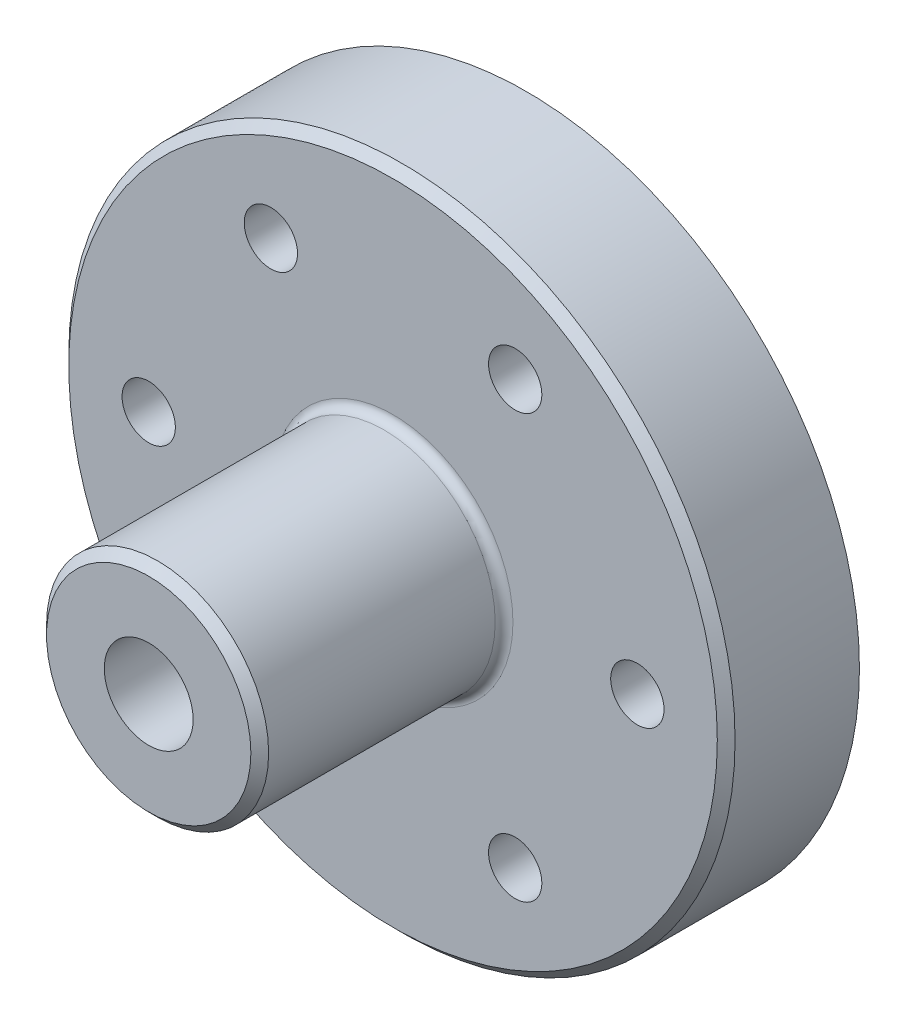
ISO-10303-21;
HEADER;
FILE_DESCRIPTION(('STEP AP214'),'2;1');
FILE_NAME('part.step','',(''),(''),'','','');
FILE_SCHEMA(('AUTOMOTIVE_DESIGN { 1 0 10303 214 1 1 1 1 }'));
ENDSEC;
DATA;
#1=APPLICATION_CONTEXT('core data for automotive mechanical design processes');
#2=APPLICATION_PROTOCOL_DEFINITION('international standard','automotive_design',2000,#1);
#3=PRODUCT_CONTEXT('',#1,'mechanical');
#4=PRODUCT('Part','Part','',(#3));
#5=PRODUCT_RELATED_PRODUCT_CATEGORY('part','',(#4));
#6=PRODUCT_DEFINITION_FORMATION('','',#4);
#7=PRODUCT_DEFINITION_CONTEXT('part definition',#1,'design');
#8=PRODUCT_DEFINITION('design','',#6,#7);
#9=PRODUCT_DEFINITION_SHAPE('','',#8);
#10=(LENGTH_UNIT() NAMED_UNIT(*) SI_UNIT(.MILLI.,.METRE.));
#11=(NAMED_UNIT(*) PLANE_ANGLE_UNIT() SI_UNIT($,.RADIAN.));
#12=(NAMED_UNIT(*) SI_UNIT($,.STERADIAN.) SOLID_ANGLE_UNIT());
#13=UNCERTAINTY_MEASURE_WITH_UNIT(LENGTH_MEASURE(1.E-05),#10,'distance_accuracy_value','');
#14=(GEOMETRIC_REPRESENTATION_CONTEXT(3) GLOBAL_UNCERTAINTY_ASSIGNED_CONTEXT((#13)) GLOBAL_UNIT_ASSIGNED_CONTEXT((#10,
#11,#12)) REPRESENTATION_CONTEXT('',''));
#15=CARTESIAN_POINT('',(0.,0.,0.));
#16=DIRECTION('',(0.,0.,1.));
#17=DIRECTION('',(1.,0.,0.));
#18=AXIS2_PLACEMENT_3D('',#15,#16,#17);
#19=CARTESIAN_POINT('',(0.,0.,30.));
#20=DIRECTION('',(0.,0.,1.));
#21=DIRECTION('',(1.,0.,0.));
#22=AXIS2_PLACEMENT_3D('',#19,#20,#21);
#23=PLANE('',#22);
#24=CARTESIAN_POINT('',(0.,0.,30.));
#25=DIRECTION('',(0.,0.,1.));
#26=DIRECTION('',(1.,0.,0.));
#27=AXIS2_PLACEMENT_3D('',#24,#25,#26);
#28=CIRCLE('',#27,27.);
#29=CARTESIAN_POINT('',(27.,0.,30.));
#30=VERTEX_POINT('',#29);
#31=EDGE_CURVE('E10',#30,#30,#28,.F.);
#32=ORIENTED_EDGE('',*,*,#31,.T.);
#33=EDGE_LOOP('',(#32));
#34=FACE_BOUND('',#33,.T.);
#35=CARTESIAN_POINT('',(0.,0.,30.));
#36=DIRECTION('',(0.,0.,1.));
#37=DIRECTION('',(1.,0.,0.));
#38=AXIS2_PLACEMENT_3D('',#35,#36,#37);
#39=CIRCLE('',#38,73.);
#40=CARTESIAN_POINT('',(73.,0.,30.));
#41=VERTEX_POINT('',#40);
#42=EDGE_CURVE('E71',#41,#41,#39,.T.);
#43=ORIENTED_EDGE('',*,*,#42,.T.);
#44=EDGE_LOOP('',(#43));
#45=FACE_BOUND('',#44,.T.);
#46=CARTESIAN_POINT('',(27.4999999999996,-47.6313972081444,30.));
#47=DIRECTION('',(0.,0.,1.));
#48=DIRECTION('',(1.,0.,0.));
#49=AXIS2_PLACEMENT_3D('',#46,#47,#48);
#50=CIRCLE('',#49,5.99999999999999);
#51=CARTESIAN_POINT('',(33.4999999999995,-47.6313972081444,30.));
#52=VERTEX_POINT('',#51);
#53=EDGE_CURVE('E112',#52,#52,#50,.T.);
#54=ORIENTED_EDGE('',*,*,#53,.F.);
#55=EDGE_LOOP('',(#54));
#56=FACE_BOUND('',#55,.T.);
#57=CARTESIAN_POINT('',(27.5000000000002,47.631397208144,30.));
#58=DIRECTION('',(0.,0.,1.));
#59=DIRECTION('',(1.,0.,0.));
#60=AXIS2_PLACEMENT_3D('',#57,#58,#59);
#61=CIRCLE('',#60,6.);
#62=CARTESIAN_POINT('',(33.5000000000002,47.631397208144,30.));
#63=VERTEX_POINT('',#62);
#64=EDGE_CURVE('E96',#63,#63,#61,.T.);
#65=ORIENTED_EDGE('',*,*,#64,.F.);
#66=EDGE_LOOP('',(#65));
#67=FACE_BOUND('',#66,.T.);
#68=CARTESIAN_POINT('',(-55.,0.,30.));
#69=DIRECTION('',(0.,0.,1.));
#70=DIRECTION('',(1.,0.,0.));
#71=AXIS2_PLACEMENT_3D('',#68,#69,#70);
#72=CIRCLE('',#71,5.99999999999999);
#73=CARTESIAN_POINT('',(-49.,0.,30.));
#74=VERTEX_POINT('',#73);
#75=EDGE_CURVE('E83',#74,#74,#72,.T.);
#76=ORIENTED_EDGE('',*,*,#75,.F.);
#77=EDGE_LOOP('',(#76));
#78=FACE_BOUND('',#77,.T.);
#79=CARTESIAN_POINT('',(-27.4999999999999,47.6313972081442,30.));
#80=DIRECTION('',(0.,0.,1.));
#81=DIRECTION('',(1.,0.,0.));
#82=AXIS2_PLACEMENT_3D('',#79,#80,#81);
#83=CIRCLE('',#82,5.99999999999999);
#84=CARTESIAN_POINT('',(-21.4999999999999,47.6313972081442,30.));
#85=VERTEX_POINT('',#84);
#86=EDGE_CURVE('E88',#85,#85,#83,.T.);
#87=ORIENTED_EDGE('',*,*,#86,.F.);
#88=EDGE_LOOP('',(#87));
#89=FACE_BOUND('',#88,.T.);
#90=CARTESIAN_POINT('',(55.,-3.84062947272745E-13,30.));
#91=DIRECTION('',(0.,0.,1.));
#92=DIRECTION('',(1.,0.,0.));
#93=AXIS2_PLACEMENT_3D('',#90,#91,#92);
#94=CIRCLE('',#93,6.);
#95=CARTESIAN_POINT('',(61.,-3.84062947272745E-13,30.));
#96=VERTEX_POINT('',#95);
#97=EDGE_CURVE('E104',#96,#96,#94,.T.);
#98=ORIENTED_EDGE('',*,*,#97,.F.);
#99=EDGE_LOOP('',(#98));
#100=FACE_BOUND('',#99,.T.);
#101=CARTESIAN_POINT('',(-27.5000000000006,-47.6313972081438,30.));
#102=DIRECTION('',(0.,0.,1.));
#103=DIRECTION('',(1.,0.,0.));
#104=AXIS2_PLACEMENT_3D('',#101,#102,#103);
#105=CIRCLE('',#104,5.99999999999999);
#106=CARTESIAN_POINT('',(-21.5000000000006,-47.6313972081438,30.));
#107=VERTEX_POINT('',#106);
#108=EDGE_CURVE('E120',#107,#107,#105,.T.);
#109=ORIENTED_EDGE('',*,*,#108,.F.);
#110=EDGE_LOOP('',(#109));
#111=FACE_BOUND('',#110,.T.);
#112=ADVANCED_FACE('F43',(#34,#45,#56,#67,#78,#89,#100,#111),#23,.T.);
#113=CARTESIAN_POINT('',(0.,0.,0.));
#114=DIRECTION('',(0.,0.,1.));
#115=DIRECTION('',(1.,0.,0.));
#116=AXIS2_PLACEMENT_3D('',#113,#114,#115);
#117=PLANE('',#116);
#118=CARTESIAN_POINT('',(0.,0.,0.));
#119=DIRECTION('',(0.,0.,1.));
#120=DIRECTION('',(1.,0.,0.));
#121=AXIS2_PLACEMENT_3D('',#118,#119,#120);
#122=CIRCLE('',#121,75.);
#123=CARTESIAN_POINT('',(75.,0.,0.));
#124=VERTEX_POINT('',#123);
#125=EDGE_CURVE('E79',#124,#124,#122,.T.);
#126=ORIENTED_EDGE('',*,*,#125,.F.);
#127=EDGE_LOOP('',(#126));
#128=FACE_BOUND('',#127,.T.);
#129=CARTESIAN_POINT('',(-55.,0.,0.));
#130=DIRECTION('',(0.,0.,1.));
#131=DIRECTION('',(1.,0.,0.));
#132=AXIS2_PLACEMENT_3D('',#129,#130,#131);
#133=CIRCLE('',#132,5.99999999999999);
#134=CARTESIAN_POINT('',(-49.,0.,0.));
#135=VERTEX_POINT('',#134);
#136=EDGE_CURVE('E84',#135,#135,#133,.T.);
#137=ORIENTED_EDGE('',*,*,#136,.T.);
#138=EDGE_LOOP('',(#137));
#139=FACE_BOUND('',#138,.T.);
#140=CARTESIAN_POINT('',(-27.4999999999999,47.6313972081442,0.));
#141=DIRECTION('',(0.,0.,1.));
#142=DIRECTION('',(1.,0.,0.));
#143=AXIS2_PLACEMENT_3D('',#140,#141,#142);
#144=CIRCLE('',#143,5.99999999999999);
#145=CARTESIAN_POINT('',(-21.4999999999999,47.6313972081442,0.));
#146=VERTEX_POINT('',#145);
#147=EDGE_CURVE('E92',#146,#146,#144,.T.);
#148=ORIENTED_EDGE('',*,*,#147,.T.);
#149=EDGE_LOOP('',(#148));
#150=FACE_BOUND('',#149,.T.);
#151=CARTESIAN_POINT('',(27.5000000000002,47.631397208144,0.));
#152=DIRECTION('',(0.,0.,1.));
#153=DIRECTION('',(1.,0.,0.));
#154=AXIS2_PLACEMENT_3D('',#151,#152,#153);
#155=CIRCLE('',#154,6.);
#156=CARTESIAN_POINT('',(33.5000000000002,47.631397208144,0.));
#157=VERTEX_POINT('',#156);
#158=EDGE_CURVE('E100',#157,#157,#155,.T.);
#159=ORIENTED_EDGE('',*,*,#158,.T.);
#160=EDGE_LOOP('',(#159));
#161=FACE_BOUND('',#160,.T.);
#162=CARTESIAN_POINT('',(55.,-3.84062947272745E-13,0.));
#163=DIRECTION('',(0.,0.,1.));
#164=DIRECTION('',(1.,0.,0.));
#165=AXIS2_PLACEMENT_3D('',#162,#163,#164);
#166=CIRCLE('',#165,6.);
#167=CARTESIAN_POINT('',(61.,-3.84062947272745E-13,0.));
#168=VERTEX_POINT('',#167);
#169=EDGE_CURVE('E108',#168,#168,#166,.T.);
#170=ORIENTED_EDGE('',*,*,#169,.T.);
#171=EDGE_LOOP('',(#170));
#172=FACE_BOUND('',#171,.T.);
#173=CARTESIAN_POINT('',(27.4999999999996,-47.6313972081444,0.));
#174=DIRECTION('',(0.,0.,1.));
#175=DIRECTION('',(1.,0.,0.));
#176=AXIS2_PLACEMENT_3D('',#173,#174,#175);
#177=CIRCLE('',#176,5.99999999999999);
#178=CARTESIAN_POINT('',(33.4999999999995,-47.6313972081444,0.));
#179=VERTEX_POINT('',#178);
#180=EDGE_CURVE('E116',#179,#179,#177,.T.);
#181=ORIENTED_EDGE('',*,*,#180,.T.);
#182=EDGE_LOOP('',(#181));
#183=FACE_BOUND('',#182,.T.);
#184=CARTESIAN_POINT('',(-27.5000000000006,-47.6313972081438,0.));
#185=DIRECTION('',(0.,0.,1.));
#186=DIRECTION('',(1.,0.,0.));
#187=AXIS2_PLACEMENT_3D('',#184,#185,#186);
#188=CIRCLE('',#187,5.99999999999999);
#189=CARTESIAN_POINT('',(-21.5000000000006,-47.6313972081438,0.));
#190=VERTEX_POINT('',#189);
#191=EDGE_CURVE('E124',#190,#190,#188,.T.);
#192=ORIENTED_EDGE('',*,*,#191,.T.);
#193=EDGE_LOOP('',(#192));
#194=FACE_BOUND('',#193,.T.);
#195=ADVANCED_FACE('F155',(#128,#139,#150,#161,#172,#183,#194),#117,.F.);
#196=CARTESIAN_POINT('',(0.,0.,30.));
#197=DIRECTION('',(0.,0.,-1.));
#198=DIRECTION('',(-1.,0.,0.));
#199=AXIS2_PLACEMENT_3D('',#196,#197,#198);
#200=CYLINDRICAL_SURFACE('',#199,75.);
#201=CARTESIAN_POINT('',(0.,0.,28.));
#202=DIRECTION('',(0.,0.,1.));
#203=DIRECTION('',(1.,0.,0.));
#204=AXIS2_PLACEMENT_3D('',#201,#202,#203);
#205=CIRCLE('',#204,75.);
#206=CARTESIAN_POINT('',(75.,0.,28.));
#207=VERTEX_POINT('',#206);
#208=EDGE_CURVE('E67',#207,#207,#205,.F.);
#209=ORIENTED_EDGE('',*,*,#208,.T.);
#210=EDGE_LOOP('',(#209));
#211=FACE_BOUND('',#210,.T.);
#212=ORIENTED_EDGE('',*,*,#125,.T.);
#213=EDGE_LOOP('',(#212));
#214=FACE_BOUND('',#213,.T.);
#215=ADVANCED_FACE('F161',(#211,#214),#200,.T.);
#216=CARTESIAN_POINT('',(-55.,0.,30.));
#217=DIRECTION('',(0.,0.,-1.));
#218=DIRECTION('',(-1.,0.,0.));
#219=AXIS2_PLACEMENT_3D('',#216,#217,#218);
#220=CYLINDRICAL_SURFACE('',#219,5.99999999999999);
#221=ORIENTED_EDGE('',*,*,#75,.T.);
#222=EDGE_LOOP('',(#221));
#223=FACE_BOUND('',#222,.T.);
#224=ORIENTED_EDGE('',*,*,#136,.F.);
#225=EDGE_LOOP('',(#224));
#226=FACE_BOUND('',#225,.T.);
#227=ADVANCED_FACE('F223',(#223,#226),#220,.F.);
#228=CARTESIAN_POINT('',(-27.4999999999999,47.6313972081442,30.));
#229=DIRECTION('',(0.,0.,-1.));
#230=DIRECTION('',(-1.,0.,0.));
#231=AXIS2_PLACEMENT_3D('',#228,#229,#230);
#232=CYLINDRICAL_SURFACE('',#231,5.99999999999999);
#233=ORIENTED_EDGE('',*,*,#86,.T.);
#234=EDGE_LOOP('',(#233));
#235=FACE_BOUND('',#234,.T.);
#236=ORIENTED_EDGE('',*,*,#147,.F.);
#237=EDGE_LOOP('',(#236));
#238=FACE_BOUND('',#237,.T.);
#239=ADVANCED_FACE('F280',(#235,#238),#232,.F.);
#240=CARTESIAN_POINT('',(27.5000000000002,47.631397208144,30.));
#241=DIRECTION('',(0.,0.,-1.));
#242=DIRECTION('',(-1.,0.,0.));
#243=AXIS2_PLACEMENT_3D('',#240,#241,#242);
#244=CYLINDRICAL_SURFACE('',#243,6.);
#245=ORIENTED_EDGE('',*,*,#64,.T.);
#246=EDGE_LOOP('',(#245));
#247=FACE_BOUND('',#246,.T.);
#248=ORIENTED_EDGE('',*,*,#158,.F.);
#249=EDGE_LOOP('',(#248));
#250=FACE_BOUND('',#249,.T.);
#251=ADVANCED_FACE('F270',(#247,#250),#244,.F.);
#252=CARTESIAN_POINT('',(55.,-3.84062947272745E-13,30.));
#253=DIRECTION('',(0.,0.,-1.));
#254=DIRECTION('',(-1.,0.,0.));
#255=AXIS2_PLACEMENT_3D('',#252,#253,#254);
#256=CYLINDRICAL_SURFACE('',#255,6.);
#257=ORIENTED_EDGE('',*,*,#97,.T.);
#258=EDGE_LOOP('',(#257));
#259=FACE_BOUND('',#258,.T.);
#260=ORIENTED_EDGE('',*,*,#169,.F.);
#261=EDGE_LOOP('',(#260));
#262=FACE_BOUND('',#261,.T.);
#263=ADVANCED_FACE('F260',(#259,#262),#256,.F.);
#264=CARTESIAN_POINT('',(27.4999999999996,-47.6313972081444,30.));
#265=DIRECTION('',(0.,0.,-1.));
#266=DIRECTION('',(-1.,0.,0.));
#267=AXIS2_PLACEMENT_3D('',#264,#265,#266);
#268=CYLINDRICAL_SURFACE('',#267,5.99999999999999);
#269=ORIENTED_EDGE('',*,*,#53,.T.);
#270=EDGE_LOOP('',(#269));
#271=FACE_BOUND('',#270,.T.);
#272=ORIENTED_EDGE('',*,*,#180,.F.);
#273=EDGE_LOOP('',(#272));
#274=FACE_BOUND('',#273,.T.);
#275=ADVANCED_FACE('F150',(#271,#274),#268,.F.);
#276=CARTESIAN_POINT('',(-27.5000000000006,-47.6313972081438,30.));
#277=DIRECTION('',(0.,0.,-1.));
#278=DIRECTION('',(-1.,0.,0.));
#279=AXIS2_PLACEMENT_3D('',#276,#277,#278);
#280=CYLINDRICAL_SURFACE('',#279,5.99999999999999);
#281=ORIENTED_EDGE('',*,*,#108,.T.);
#282=EDGE_LOOP('',(#281));
#283=FACE_BOUND('',#282,.T.);
#284=ORIENTED_EDGE('',*,*,#191,.F.);
#285=EDGE_LOOP('',(#284));
#286=FACE_BOUND('',#285,.T.);
#287=ADVANCED_FACE('F142',(#283,#286),#280,.F.);
#288=CARTESIAN_POINT('',(0.,0.,85.));
#289=DIRECTION('',(0.,0.,1.));
#290=DIRECTION('',(1.,0.,0.));
#291=AXIS2_PLACEMENT_3D('',#288,#289,#290);
#292=PLANE('',#291);
#293=CARTESIAN_POINT('',(0.,0.,85.));
#294=DIRECTION('',(0.,0.,1.));
#295=DIRECTION('',(1.,0.,0.));
#296=AXIS2_PLACEMENT_3D('',#293,#294,#295);
#297=CIRCLE('',#296,23.);
#298=CARTESIAN_POINT('',(23.,0.,85.));
#299=VERTEX_POINT('',#298);
#300=EDGE_CURVE('E61',#299,#299,#297,.T.);
#301=ORIENTED_EDGE('',*,*,#300,.T.);
#302=EDGE_LOOP('',(#301));
#303=FACE_BOUND('',#302,.T.);
#304=CARTESIAN_POINT('',(0.,0.,85.));
#305=DIRECTION('',(0.,0.,1.));
#306=DIRECTION('',(1.,0.,0.));
#307=AXIS2_PLACEMENT_3D('',#304,#305,#306);
#308=CIRCLE('',#307,10.);
#309=CARTESIAN_POINT('',(10.,0.,85.));
#310=VERTEX_POINT('',#309);
#311=EDGE_CURVE('E128',#310,#310,#308,.T.);
#312=ORIENTED_EDGE('',*,*,#311,.F.);
#313=EDGE_LOOP('',(#312));
#314=FACE_BOUND('',#313,.T.);
#315=ADVANCED_FACE('F139',(#303,#314),#292,.T.);
#316=CARTESIAN_POINT('',(0.,0.,85.));
#317=DIRECTION('',(0.,0.,-1.));
#318=DIRECTION('',(-1.,0.,0.));
#319=AXIS2_PLACEMENT_3D('',#316,#317,#318);
#320=CYLINDRICAL_SURFACE('',#319,25.);
#321=CARTESIAN_POINT('',(0.,0.,32.));
#322=DIRECTION('',(0.,0.,1.));
#323=DIRECTION('',(1.,0.,0.));
#324=AXIS2_PLACEMENT_3D('',#321,#322,#323);
#325=CIRCLE('',#324,25.);
#326=CARTESIAN_POINT('',(25.,0.,32.));
#327=VERTEX_POINT('',#326);
#328=EDGE_CURVE('E51',#327,#327,#325,.T.);
#329=ORIENTED_EDGE('',*,*,#328,.T.);
#330=EDGE_LOOP('',(#329));
#331=FACE_BOUND('',#330,.T.);
#332=CARTESIAN_POINT('',(0.,0.,82.9999999999999));
#333=DIRECTION('',(0.,0.,1.));
#334=DIRECTION('',(1.,0.,0.));
#335=AXIS2_PLACEMENT_3D('',#332,#333,#334);
#336=CIRCLE('',#335,25.);
#337=CARTESIAN_POINT('',(25.,0.,82.9999999999999));
#338=VERTEX_POINT('',#337);
#339=EDGE_CURVE('E56',#338,#338,#336,.F.);
#340=ORIENTED_EDGE('',*,*,#339,.T.);
#341=EDGE_LOOP('',(#340));
#342=FACE_BOUND('',#341,.T.);
#343=ADVANCED_FACE('F141',(#331,#342),#320,.T.);
#344=CARTESIAN_POINT('',(0.,0.,85.));
#345=DIRECTION('',(0.,0.,-1.));
#346=DIRECTION('',(-1.,0.,0.));
#347=AXIS2_PLACEMENT_3D('',#344,#345,#346);
#348=CYLINDRICAL_SURFACE('',#347,10.);
#349=ORIENTED_EDGE('',*,*,#311,.T.);
#350=EDGE_LOOP('',(#349));
#351=FACE_BOUND('',#350,.T.);
#352=CARTESIAN_POINT('',(0.,0.,30.));
#353=DIRECTION('',(0.,0.,1.));
#354=DIRECTION('',(1.,0.,0.));
#355=AXIS2_PLACEMENT_3D('',#352,#353,#354);
#356=CIRCLE('',#355,10.);
#357=CARTESIAN_POINT('',(10.,0.,30.));
#358=VERTEX_POINT('',#357);
#359=EDGE_CURVE('E75',#358,#358,#356,.F.);
#360=ORIENTED_EDGE('',*,*,#359,.T.);
#361=EDGE_LOOP('',(#360));
#362=FACE_BOUND('',#361,.T.);
#363=ADVANCED_FACE('F136',(#351,#362),#348,.F.);
#364=ORIENTED_EDGE('',*,*,#359,.F.);
#365=EDGE_LOOP('',(#364));
#366=FACE_BOUND('',#365,.T.);
#367=ADVANCED_FACE('F157',(#366),#23,.T.);
#368=CARTESIAN_POINT('',(0.,0.,30.));
#369=DIRECTION('',(0.,0.,-1.));
#370=DIRECTION('',(-1.,0.,0.));
#371=AXIS2_PLACEMENT_3D('',#368,#369,#370);
#372=CONICAL_SURFACE('',#371,73.,0.785398163397441);
#373=ORIENTED_EDGE('',*,*,#208,.F.);
#374=EDGE_LOOP('',(#373));
#375=FACE_BOUND('',#374,.T.);
#376=ORIENTED_EDGE('',*,*,#42,.F.);
#377=EDGE_LOOP('',(#376));
#378=FACE_BOUND('',#377,.T.);
#379=ADVANCED_FACE('F167',(#375,#378),#372,.T.);
#380=CARTESIAN_POINT('',(0.,0.,85.));
#381=DIRECTION('',(0.,0.,-1.));
#382=DIRECTION('',(-1.,0.,0.));
#383=AXIS2_PLACEMENT_3D('',#380,#381,#382);
#384=CONICAL_SURFACE('',#383,23.,0.785398163397447);
#385=ORIENTED_EDGE('',*,*,#339,.F.);
#386=EDGE_LOOP('',(#385));
#387=FACE_BOUND('',#386,.T.);
#388=ORIENTED_EDGE('',*,*,#300,.F.);
#389=EDGE_LOOP('',(#388));
#390=FACE_BOUND('',#389,.T.);
#391=ADVANCED_FACE('F173',(#387,#390),#384,.T.);
#392=CARTESIAN_POINT('',(0.,0.,32.));
#393=DIRECTION('',(0.,0.,1.));
#394=DIRECTION('',(1.,0.,0.));
#395=AXIS2_PLACEMENT_3D('',#392,#393,#394);
#396=TOROIDAL_SURFACE('',#395,27.,2.);
#397=ORIENTED_EDGE('',*,*,#31,.F.);
#398=EDGE_LOOP('',(#397));
#399=FACE_BOUND('',#398,.T.);
#400=ORIENTED_EDGE('',*,*,#328,.F.);
#401=EDGE_LOOP('',(#400));
#402=FACE_BOUND('',#401,.T.);
#403=ADVANCED_FACE('F45',(#399,#402),#396,.F.);
#404=CLOSED_SHELL('',(#112,#195,#215,#227,#239,#251,#263,#275,#287,#315,#343,#363,#367,#379,
#391,#403));
#405=MANIFOLD_SOLID_BREP('B2',#404);
#406=ADVANCED_BREP_SHAPE_REPRESENTATION('',(#18,#405),#14);
#407=SHAPE_DEFINITION_REPRESENTATION(#9,#406);
ENDSEC;
END-ISO-10303-21;
